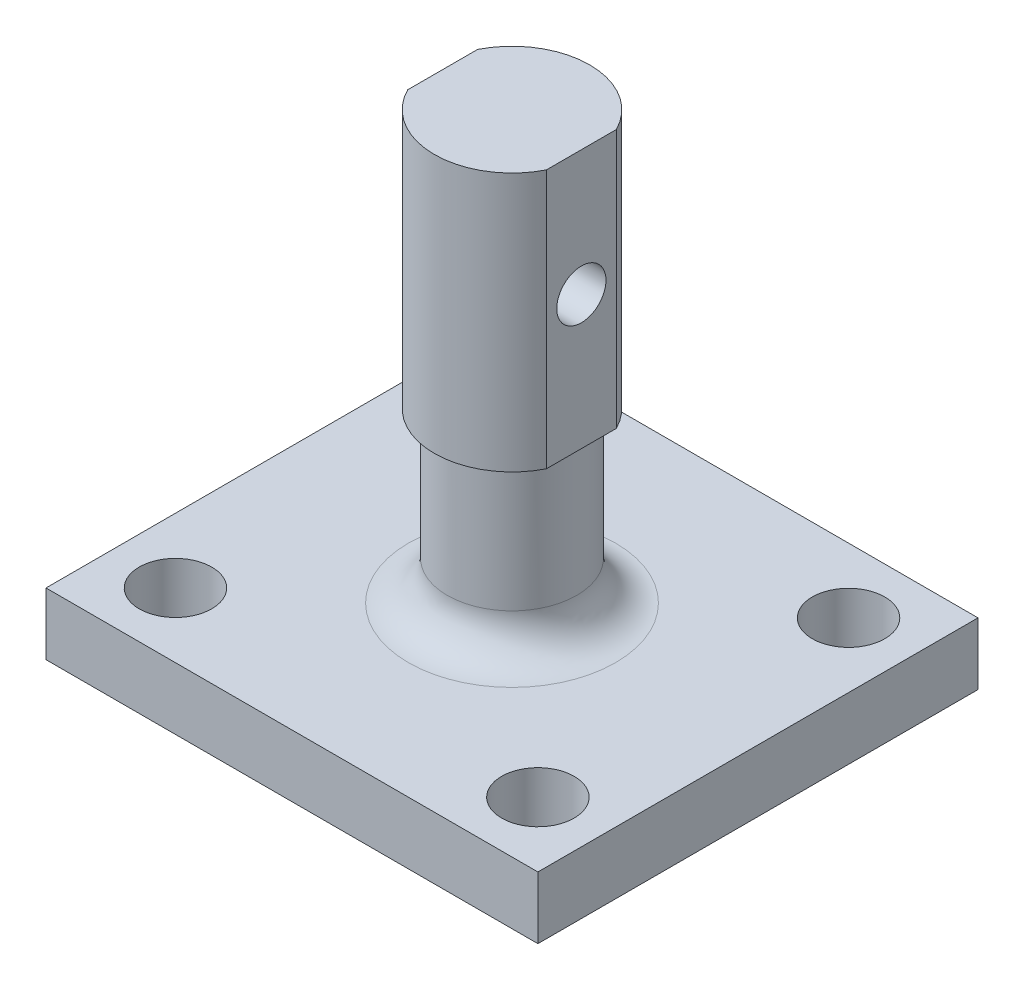
ISO-10303-21;
HEADER;
FILE_DESCRIPTION(('STEP AP214'),'2;1');
FILE_NAME('part.step','',(''),(''),'','','');
FILE_SCHEMA(('AUTOMOTIVE_DESIGN { 1 0 10303 214 1 1 1 1 }'));
ENDSEC;
DATA;
#1=APPLICATION_CONTEXT('core data for automotive mechanical design processes');
#2=APPLICATION_PROTOCOL_DEFINITION('international standard','automotive_design',2000,#1);
#3=PRODUCT_CONTEXT('',#1,'mechanical');
#4=PRODUCT('Part','Part','',(#3));
#5=PRODUCT_RELATED_PRODUCT_CATEGORY('part','',(#4));
#6=PRODUCT_DEFINITION_FORMATION('','',#4);
#7=PRODUCT_DEFINITION_CONTEXT('part definition',#1,'design');
#8=PRODUCT_DEFINITION('design','',#6,#7);
#9=PRODUCT_DEFINITION_SHAPE('','',#8);
#10=(LENGTH_UNIT() NAMED_UNIT(*) SI_UNIT(.MILLI.,.METRE.));
#11=(NAMED_UNIT(*) PLANE_ANGLE_UNIT() SI_UNIT($,.RADIAN.));
#12=(NAMED_UNIT(*) SI_UNIT($,.STERADIAN.) SOLID_ANGLE_UNIT());
#13=UNCERTAINTY_MEASURE_WITH_UNIT(LENGTH_MEASURE(1.E-05),#10,'distance_accuracy_value','');
#14=(GEOMETRIC_REPRESENTATION_CONTEXT(3) GLOBAL_UNCERTAINTY_ASSIGNED_CONTEXT((#13)) GLOBAL_UNIT_ASSIGNED_CONTEXT((#10,
#11,#12)) REPRESENTATION_CONTEXT('',''));
#15=CARTESIAN_POINT('',(0.,0.,0.));
#16=DIRECTION('',(0.,0.,1.));
#17=DIRECTION('',(1.,0.,0.));
#18=AXIS2_PLACEMENT_3D('',#15,#16,#17);
#19=CARTESIAN_POINT('',(0.,9.45,0.));
#20=DIRECTION('',(0.,-1.,0.));
#21=DIRECTION('',(0.,0.,-1.));
#22=AXIS2_PLACEMENT_3D('',#19,#20,#21);
#23=CYLINDRICAL_SURFACE('',#22,1.5);
#24=CARTESIAN_POINT('',(0.,9.45,0.));
#25=DIRECTION('',(0.,1.,0.));
#26=DIRECTION('',(0.,0.,1.));
#27=AXIS2_PLACEMENT_3D('',#24,#25,#26);
#28=CIRCLE('',#27,1.5);
#29=CARTESIAN_POINT('',(-1.33954283246188,9.45,0.675));
#30=VERTEX_POINT('',#29);
#31=CARTESIAN_POINT('',(1.33954283246188,9.45,0.675));
#32=VERTEX_POINT('',#31);
#33=EDGE_CURVE('E126',#30,#32,#28,.T.);
#34=ORIENTED_EDGE('',*,*,#33,.F.);
#35=DIRECTION('',(0.,1.,0.));
#36=VECTOR('',#35,1.);
#37=CARTESIAN_POINT('',(-1.33954283246188,3.45,0.675));
#38=LINE('',#37,#36);
#39=CARTESIAN_POINT('',(-1.33954283246188,4.45,0.675));
#40=VERTEX_POINT('',#39);
#41=EDGE_CURVE('E111',#40,#30,#38,.T.);
#42=ORIENTED_EDGE('',*,*,#41,.F.);
#43=CARTESIAN_POINT('',(0.,4.45,0.));
#44=DIRECTION('',(0.,1.,0.));
#45=DIRECTION('',(0.,0.,1.));
#46=AXIS2_PLACEMENT_3D('',#43,#44,#45);
#47=CIRCLE('',#46,1.5);
#48=CARTESIAN_POINT('',(1.33954283246188,4.45,0.675));
#49=VERTEX_POINT('',#48);
#50=EDGE_CURVE('E139',#40,#49,#47,.T.);
#51=ORIENTED_EDGE('',*,*,#50,.T.);
#52=DIRECTION('',(0.,1.,0.));
#53=VECTOR('',#52,1.);
#54=CARTESIAN_POINT('',(1.33954283246188,3.45,0.675));
#55=LINE('',#54,#53);
#56=EDGE_CURVE('E71',#49,#32,#55,.T.);
#57=ORIENTED_EDGE('',*,*,#56,.T.);
#58=EDGE_LOOP('',(#34,#42,#51,#57));
#59=FACE_BOUND('',#58,.T.);
#60=ADVANCED_FACE('F47',(#59),#23,.T.);
#61=CARTESIAN_POINT('',(4.75,1.2,-4.25));
#62=DIRECTION('',(-1.,0.,0.));
#63=DIRECTION('',(0.,0.,1.));
#64=AXIS2_PLACEMENT_3D('',#61,#62,#63);
#65=PLANE('',#64);
#66=DIRECTION('',(0.,0.,-1.));
#67=VECTOR('',#66,1.);
#68=CARTESIAN_POINT('',(4.75,0.,-4.25));
#69=LINE('',#68,#67);
#70=CARTESIAN_POINT('',(4.75,0.,4.25));
#71=VERTEX_POINT('',#70);
#72=CARTESIAN_POINT('',(4.75,0.,-4.25));
#73=VERTEX_POINT('',#72);
#74=EDGE_CURVE('E181',#71,#73,#69,.T.);
#75=ORIENTED_EDGE('',*,*,#74,.T.);
#76=DIRECTION('',(0.,-1.,0.));
#77=VECTOR('',#76,1.);
#78=CARTESIAN_POINT('',(4.75,1.2,-4.25));
#79=LINE('',#78,#77);
#80=CARTESIAN_POINT('',(4.75,1.2,-4.25));
#81=VERTEX_POINT('',#80);
#82=EDGE_CURVE('E218',#81,#73,#79,.T.);
#83=ORIENTED_EDGE('',*,*,#82,.F.);
#84=DIRECTION('',(0.,0.,-1.));
#85=VECTOR('',#84,1.);
#86=CARTESIAN_POINT('',(4.75,1.2,-4.25));
#87=LINE('',#86,#85);
#88=CARTESIAN_POINT('',(4.75,1.2,4.25));
#89=VERTEX_POINT('',#88);
#90=EDGE_CURVE('E182',#89,#81,#87,.T.);
#91=ORIENTED_EDGE('',*,*,#90,.F.);
#92=DIRECTION('',(0.,-1.,0.));
#93=VECTOR('',#92,1.);
#94=CARTESIAN_POINT('',(4.75,1.2,4.25));
#95=LINE('',#94,#93);
#96=EDGE_CURVE('E196',#89,#71,#95,.T.);
#97=ORIENTED_EDGE('',*,*,#96,.T.);
#98=EDGE_LOOP('',(#75,#83,#91,#97));
#99=FACE_BOUND('',#98,.T.);
#100=ADVANCED_FACE('F268',(#99),#65,.F.);
#101=CARTESIAN_POINT('',(-4.75,1.2,-4.25));
#102=DIRECTION('',(0.,0.,1.));
#103=DIRECTION('',(1.,0.,0.));
#104=AXIS2_PLACEMENT_3D('',#101,#102,#103);
#105=PLANE('',#104);
#106=DIRECTION('',(-1.,0.,0.));
#107=VECTOR('',#106,1.);
#108=CARTESIAN_POINT('',(-4.75,0.,-4.25));
#109=LINE('',#108,#107);
#110=CARTESIAN_POINT('',(-4.75,0.,-4.25));
#111=VERTEX_POINT('',#110);
#112=EDGE_CURVE('E200',#73,#111,#109,.T.);
#113=ORIENTED_EDGE('',*,*,#112,.T.);
#114=DIRECTION('',(0.,-1.,0.));
#115=VECTOR('',#114,1.);
#116=CARTESIAN_POINT('',(-4.75,1.2,-4.25));
#117=LINE('',#116,#115);
#118=CARTESIAN_POINT('',(-4.75,1.2,-4.25));
#119=VERTEX_POINT('',#118);
#120=EDGE_CURVE('E214',#119,#111,#117,.T.);
#121=ORIENTED_EDGE('',*,*,#120,.F.);
#122=DIRECTION('',(-1.,0.,0.));
#123=VECTOR('',#122,1.);
#124=CARTESIAN_POINT('',(-4.75,1.2,-4.25));
#125=LINE('',#124,#123);
#126=EDGE_CURVE('E186',#81,#119,#125,.T.);
#127=ORIENTED_EDGE('',*,*,#126,.F.);
#128=ORIENTED_EDGE('',*,*,#82,.T.);
#129=EDGE_LOOP('',(#113,#121,#127,#128));
#130=FACE_BOUND('',#129,.T.);
#131=ADVANCED_FACE('F273',(#130),#105,.F.);
#132=CARTESIAN_POINT('',(-4.75,1.2,-4.25));
#133=DIRECTION('',(1.,0.,0.));
#134=DIRECTION('',(0.,0.,-1.));
#135=AXIS2_PLACEMENT_3D('',#132,#133,#134);
#136=PLANE('',#135);
#137=DIRECTION('',(0.,0.,1.));
#138=VECTOR('',#137,1.);
#139=CARTESIAN_POINT('',(-4.75,0.,-4.25));
#140=LINE('',#139,#138);
#141=CARTESIAN_POINT('',(-4.75,0.,4.25));
#142=VERTEX_POINT('',#141);
#143=EDGE_CURVE('E203',#111,#142,#140,.T.);
#144=ORIENTED_EDGE('',*,*,#143,.T.);
#145=DIRECTION('',(0.,-1.,0.));
#146=VECTOR('',#145,1.);
#147=CARTESIAN_POINT('',(-4.75,1.2,4.25));
#148=LINE('',#147,#146);
#149=CARTESIAN_POINT('',(-4.75,1.2,4.25));
#150=VERTEX_POINT('',#149);
#151=EDGE_CURVE('E210',#150,#142,#148,.T.);
#152=ORIENTED_EDGE('',*,*,#151,.F.);
#153=DIRECTION('',(0.,0.,1.));
#154=VECTOR('',#153,1.);
#155=CARTESIAN_POINT('',(-4.75,1.2,-4.25));
#156=LINE('',#155,#154);
#157=EDGE_CURVE('E190',#119,#150,#156,.T.);
#158=ORIENTED_EDGE('',*,*,#157,.F.);
#159=ORIENTED_EDGE('',*,*,#120,.T.);
#160=EDGE_LOOP('',(#144,#152,#158,#159));
#161=FACE_BOUND('',#160,.T.);
#162=ADVANCED_FACE('F319',(#161),#136,.F.);
#163=CARTESIAN_POINT('',(-4.75,1.2,4.25));
#164=DIRECTION('',(0.,0.,-1.));
#165=DIRECTION('',(-1.,0.,0.));
#166=AXIS2_PLACEMENT_3D('',#163,#164,#165);
#167=PLANE('',#166);
#168=DIRECTION('',(1.,0.,0.));
#169=VECTOR('',#168,1.);
#170=CARTESIAN_POINT('',(-4.75,0.,4.25));
#171=LINE('',#170,#169);
#172=EDGE_CURVE('E187',#142,#71,#171,.T.);
#173=ORIENTED_EDGE('',*,*,#172,.T.);
#174=ORIENTED_EDGE('',*,*,#96,.F.);
#175=DIRECTION('',(1.,0.,0.));
#176=VECTOR('',#175,1.);
#177=CARTESIAN_POINT('',(-4.75,1.2,4.25));
#178=LINE('',#177,#176);
#179=EDGE_CURVE('E193',#150,#89,#178,.T.);
#180=ORIENTED_EDGE('',*,*,#179,.F.);
#181=ORIENTED_EDGE('',*,*,#151,.T.);
#182=EDGE_LOOP('',(#173,#174,#180,#181));
#183=FACE_BOUND('',#182,.T.);
#184=ADVANCED_FACE('F298',(#183),#167,.F.);
#185=CARTESIAN_POINT('',(0.,1.2,0.));
#186=DIRECTION('',(0.,1.,0.));
#187=DIRECTION('',(0.,0.,1.));
#188=AXIS2_PLACEMENT_3D('',#185,#186,#187);
#189=PLANE('',#188);
#190=CARTESIAN_POINT('',(0.,1.2,0.));
#191=DIRECTION('',(0.,1.,0.));
#192=DIRECTION('',(0.,0.,1.));
#193=AXIS2_PLACEMENT_3D('',#190,#191,#192);
#194=CIRCLE('',#193,2.);
#195=CARTESIAN_POINT('',(0.,1.2,2.));
#196=VERTEX_POINT('',#195);
#197=EDGE_CURVE('E226',#196,#196,#194,.F.);
#198=ORIENTED_EDGE('',*,*,#197,.T.);
#199=EDGE_LOOP('',(#198));
#200=FACE_BOUND('',#199,.T.);
#201=CARTESIAN_POINT('',(3.5,1.2,3.));
#202=DIRECTION('',(0.,1.,0.));
#203=DIRECTION('',(0.,0.,1.));
#204=AXIS2_PLACEMENT_3D('',#201,#202,#203);
#205=CIRCLE('',#204,0.699999999999999);
#206=CARTESIAN_POINT('',(3.5,1.2,3.7));
#207=VERTEX_POINT('',#206);
#208=EDGE_CURVE('E177',#207,#207,#205,.T.);
#209=ORIENTED_EDGE('',*,*,#208,.F.);
#210=EDGE_LOOP('',(#209));
#211=FACE_BOUND('',#210,.T.);
#212=CARTESIAN_POINT('',(3.5,1.2,-3.));
#213=DIRECTION('',(0.,1.,0.));
#214=DIRECTION('',(0.,0.,1.));
#215=AXIS2_PLACEMENT_3D('',#212,#213,#214);
#216=CIRCLE('',#215,0.699999999999999);
#217=CARTESIAN_POINT('',(3.5,1.2,-2.3));
#218=VERTEX_POINT('',#217);
#219=EDGE_CURVE('E173',#218,#218,#216,.T.);
#220=ORIENTED_EDGE('',*,*,#219,.F.);
#221=EDGE_LOOP('',(#220));
#222=FACE_BOUND('',#221,.T.);
#223=CARTESIAN_POINT('',(-3.5,1.2,-3.));
#224=DIRECTION('',(0.,1.,0.));
#225=DIRECTION('',(0.,0.,1.));
#226=AXIS2_PLACEMENT_3D('',#223,#224,#225);
#227=CIRCLE('',#226,0.7);
#228=CARTESIAN_POINT('',(-3.5,1.2,-2.3));
#229=VERTEX_POINT('',#228);
#230=EDGE_CURVE('E169',#229,#229,#227,.T.);
#231=ORIENTED_EDGE('',*,*,#230,.F.);
#232=EDGE_LOOP('',(#231));
#233=FACE_BOUND('',#232,.T.);
#234=CARTESIAN_POINT('',(-3.5,1.2,3.));
#235=DIRECTION('',(0.,1.,0.));
#236=DIRECTION('',(0.,0.,1.));
#237=AXIS2_PLACEMENT_3D('',#234,#235,#236);
#238=CIRCLE('',#237,0.7);
#239=CARTESIAN_POINT('',(-3.5,1.2,3.7));
#240=VERTEX_POINT('',#239);
#241=EDGE_CURVE('E165',#240,#240,#238,.T.);
#242=ORIENTED_EDGE('',*,*,#241,.F.);
#243=EDGE_LOOP('',(#242));
#244=FACE_BOUND('',#243,.T.);
#245=ORIENTED_EDGE('',*,*,#90,.T.);
#246=ORIENTED_EDGE('',*,*,#126,.T.);
#247=ORIENTED_EDGE('',*,*,#157,.T.);
#248=ORIENTED_EDGE('',*,*,#179,.T.);
#249=EDGE_LOOP('',(#245,#246,#247,#248));
#250=FACE_BOUND('',#249,.T.);
#251=ADVANCED_FACE('F294',(#200,#211,#222,#233,#244,#250),#189,.T.);
#252=CARTESIAN_POINT('',(0.,0.,0.));
#253=DIRECTION('',(0.,1.,0.));
#254=DIRECTION('',(0.,0.,1.));
#255=AXIS2_PLACEMENT_3D('',#252,#253,#254);
#256=PLANE('',#255);
#257=CARTESIAN_POINT('',(3.5,0.,3.));
#258=DIRECTION('',(0.,1.,0.));
#259=DIRECTION('',(0.,0.,1.));
#260=AXIS2_PLACEMENT_3D('',#257,#258,#259);
#261=CIRCLE('',#260,0.699999999999999);
#262=CARTESIAN_POINT('',(3.5,0.,3.7));
#263=VERTEX_POINT('',#262);
#264=EDGE_CURVE('E149',#263,#263,#261,.T.);
#265=ORIENTED_EDGE('',*,*,#264,.T.);
#266=EDGE_LOOP('',(#265));
#267=FACE_BOUND('',#266,.T.);
#268=CARTESIAN_POINT('',(3.5,0.,-3.));
#269=DIRECTION('',(0.,1.,0.));
#270=DIRECTION('',(0.,0.,1.));
#271=AXIS2_PLACEMENT_3D('',#268,#269,#270);
#272=CIRCLE('',#271,0.699999999999999);
#273=CARTESIAN_POINT('',(3.5,0.,-2.3));
#274=VERTEX_POINT('',#273);
#275=EDGE_CURVE('E155',#274,#274,#272,.T.);
#276=ORIENTED_EDGE('',*,*,#275,.T.);
#277=EDGE_LOOP('',(#276));
#278=FACE_BOUND('',#277,.T.);
#279=CARTESIAN_POINT('',(-3.5,0.,-3.));
#280=DIRECTION('',(0.,1.,0.));
#281=DIRECTION('',(0.,0.,1.));
#282=AXIS2_PLACEMENT_3D('',#279,#280,#281);
#283=CIRCLE('',#282,0.7);
#284=CARTESIAN_POINT('',(-3.5,0.,-2.3));
#285=VERTEX_POINT('',#284);
#286=EDGE_CURVE('E150',#285,#285,#283,.T.);
#287=ORIENTED_EDGE('',*,*,#286,.T.);
#288=EDGE_LOOP('',(#287));
#289=FACE_BOUND('',#288,.T.);
#290=CARTESIAN_POINT('',(-3.5,0.,3.));
#291=DIRECTION('',(0.,1.,0.));
#292=DIRECTION('',(0.,0.,1.));
#293=AXIS2_PLACEMENT_3D('',#290,#291,#292);
#294=CIRCLE('',#293,0.7);
#295=CARTESIAN_POINT('',(-3.5,0.,3.7));
#296=VERTEX_POINT('',#295);
#297=EDGE_CURVE('E154',#296,#296,#294,.T.);
#298=ORIENTED_EDGE('',*,*,#297,.T.);
#299=EDGE_LOOP('',(#298));
#300=FACE_BOUND('',#299,.T.);
#301=ORIENTED_EDGE('',*,*,#74,.F.);
#302=ORIENTED_EDGE('',*,*,#172,.F.);
#303=ORIENTED_EDGE('',*,*,#143,.F.);
#304=ORIENTED_EDGE('',*,*,#112,.F.);
#305=EDGE_LOOP('',(#301,#302,#303,#304));
#306=FACE_BOUND('',#305,.T.);
#307=ADVANCED_FACE('F297',(#267,#278,#289,#300,#306),#256,.F.);
#308=CARTESIAN_POINT('',(-3.5,0.,3.));
#309=DIRECTION('',(0.,1.,0.));
#310=DIRECTION('',(0.,0.,1.));
#311=AXIS2_PLACEMENT_3D('',#308,#309,#310);
#312=CYLINDRICAL_SURFACE('',#311,0.7);
#313=ORIENTED_EDGE('',*,*,#241,.T.);
#314=EDGE_LOOP('',(#313));
#315=FACE_BOUND('',#314,.T.);
#316=ORIENTED_EDGE('',*,*,#297,.F.);
#317=EDGE_LOOP('',(#316));
#318=FACE_BOUND('',#317,.T.);
#319=ADVANCED_FACE('F324',(#315,#318),#312,.F.);
#320=CARTESIAN_POINT('',(-3.5,0.,-3.));
#321=DIRECTION('',(0.,1.,0.));
#322=DIRECTION('',(0.,0.,1.));
#323=AXIS2_PLACEMENT_3D('',#320,#321,#322);
#324=CYLINDRICAL_SURFACE('',#323,0.7);
#325=ORIENTED_EDGE('',*,*,#230,.T.);
#326=EDGE_LOOP('',(#325));
#327=FACE_BOUND('',#326,.T.);
#328=ORIENTED_EDGE('',*,*,#286,.F.);
#329=EDGE_LOOP('',(#328));
#330=FACE_BOUND('',#329,.T.);
#331=ADVANCED_FACE('F330',(#327,#330),#324,.F.);
#332=CARTESIAN_POINT('',(3.5,0.,-3.));
#333=DIRECTION('',(0.,1.,0.));
#334=DIRECTION('',(0.,0.,1.));
#335=AXIS2_PLACEMENT_3D('',#332,#333,#334);
#336=CYLINDRICAL_SURFACE('',#335,0.699999999999999);
#337=ORIENTED_EDGE('',*,*,#219,.T.);
#338=EDGE_LOOP('',(#337));
#339=FACE_BOUND('',#338,.T.);
#340=ORIENTED_EDGE('',*,*,#275,.F.);
#341=EDGE_LOOP('',(#340));
#342=FACE_BOUND('',#341,.T.);
#343=ADVANCED_FACE('F370',(#339,#342),#336,.F.);
#344=CARTESIAN_POINT('',(3.5,0.,3.));
#345=DIRECTION('',(0.,1.,0.));
#346=DIRECTION('',(0.,0.,1.));
#347=AXIS2_PLACEMENT_3D('',#344,#345,#346);
#348=CYLINDRICAL_SURFACE('',#347,0.699999999999999);
#349=ORIENTED_EDGE('',*,*,#208,.T.);
#350=EDGE_LOOP('',(#349));
#351=FACE_BOUND('',#350,.T.);
#352=ORIENTED_EDGE('',*,*,#264,.F.);
#353=EDGE_LOOP('',(#352));
#354=FACE_BOUND('',#353,.T.);
#355=ADVANCED_FACE('F286',(#351,#354),#348,.F.);
#356=CARTESIAN_POINT('',(0.,4.45,0.));
#357=DIRECTION('',(0.,-1.,0.));
#358=DIRECTION('',(0.,0.,-1.));
#359=AXIS2_PLACEMENT_3D('',#356,#357,#358);
#360=CYLINDRICAL_SURFACE('',#359,1.25);
#361=CARTESIAN_POINT('',(0.,1.95,0.));
#362=DIRECTION('',(0.,1.,0.));
#363=DIRECTION('',(0.,0.,1.));
#364=AXIS2_PLACEMENT_3D('',#361,#362,#363);
#365=CIRCLE('',#364,1.25);
#366=CARTESIAN_POINT('',(0.,1.95,-1.25));
#367=VERTEX_POINT('',#366);
#368=EDGE_CURVE('E222',#367,#367,#365,.T.);
#369=CARTESIAN_POINT('',(0.,4.45,0.));
#370=DIRECTION('',(0.,1.,0.));
#371=DIRECTION('',(0.,0.,1.));
#372=AXIS2_PLACEMENT_3D('',#369,#370,#371);
#373=CIRCLE('',#372,1.25);
#374=CARTESIAN_POINT('',(0.,4.45,-1.25));
#375=VERTEX_POINT('',#374);
#376=EDGE_CURVE('E136',#375,#375,#373,.T.);
#377=CARTESIAN_POINT('',(0.,1.95,-1.25));
#378=CARTESIAN_POINT('',(0.,1.97604166666667,-1.25));
#379=CARTESIAN_POINT('',(0.,2.00208333333333,-1.25));
#380=CARTESIAN_POINT('',(0.,2.05416666666667,-1.25));
#381=CARTESIAN_POINT('',(0.,2.08020833333333,-1.25));
#382=CARTESIAN_POINT('',(0.,2.13229166666667,-1.25));
#383=CARTESIAN_POINT('',(0.,2.15833333333333,-1.25));
#384=CARTESIAN_POINT('',(0.,2.21041666666667,-1.25));
#385=CARTESIAN_POINT('',(0.,2.23645833333333,-1.25));
#386=CARTESIAN_POINT('',(0.,2.28854166666667,-1.25));
#387=CARTESIAN_POINT('',(0.,2.31458333333333,-1.25));
#388=CARTESIAN_POINT('',(0.,2.36666666666667,-1.25));
#389=CARTESIAN_POINT('',(0.,2.39270833333333,-1.25));
#390=CARTESIAN_POINT('',(0.,2.44479166666667,-1.25));
#391=CARTESIAN_POINT('',(0.,2.47083333333333,-1.25));
#392=CARTESIAN_POINT('',(0.,2.52291666666667,-1.25));
#393=CARTESIAN_POINT('',(0.,2.54895833333333,-1.25));
#394=CARTESIAN_POINT('',(0.,2.60104166666667,-1.25));
#395=CARTESIAN_POINT('',(0.,2.62708333333333,-1.25));
#396=CARTESIAN_POINT('',(0.,2.67916666666667,-1.25));
#397=CARTESIAN_POINT('',(0.,2.70520833333333,-1.25));
#398=CARTESIAN_POINT('',(0.,2.75729166666667,-1.25));
#399=CARTESIAN_POINT('',(0.,2.78333333333333,-1.25));
#400=CARTESIAN_POINT('',(0.,2.83541666666667,-1.25));
#401=CARTESIAN_POINT('',(0.,2.86145833333333,-1.25));
#402=CARTESIAN_POINT('',(0.,2.91354166666667,-1.25));
#403=CARTESIAN_POINT('',(0.,2.93958333333333,-1.25));
#404=CARTESIAN_POINT('',(0.,2.99166666666667,-1.25));
#405=CARTESIAN_POINT('',(0.,3.01770833333333,-1.25));
#406=CARTESIAN_POINT('',(0.,3.06979166666667,-1.25));
#407=CARTESIAN_POINT('',(0.,3.09583333333333,-1.25));
#408=CARTESIAN_POINT('',(0.,3.14791666666667,-1.25));
#409=CARTESIAN_POINT('',(0.,3.17395833333333,-1.25));
#410=CARTESIAN_POINT('',(0.,3.22604166666667,-1.25));
#411=CARTESIAN_POINT('',(0.,3.25208333333333,-1.25));
#412=CARTESIAN_POINT('',(0.,3.30416666666667,-1.25));
#413=CARTESIAN_POINT('',(0.,3.33020833333333,-1.25));
#414=CARTESIAN_POINT('',(0.,3.38229166666667,-1.25));
#415=CARTESIAN_POINT('',(0.,3.40833333333333,-1.25));
#416=CARTESIAN_POINT('',(0.,3.46041666666667,-1.25));
#417=CARTESIAN_POINT('',(0.,3.48645833333333,-1.25));
#418=CARTESIAN_POINT('',(0.,3.53854166666667,-1.25));
#419=CARTESIAN_POINT('',(0.,3.56458333333333,-1.25));
#420=CARTESIAN_POINT('',(0.,3.61666666666667,-1.25));
#421=CARTESIAN_POINT('',(0.,3.64270833333333,-1.25));
#422=CARTESIAN_POINT('',(0.,3.69479166666667,-1.25));
#423=CARTESIAN_POINT('',(0.,3.72083333333333,-1.25));
#424=CARTESIAN_POINT('',(0.,3.77291666666667,-1.25));
#425=CARTESIAN_POINT('',(0.,3.79895833333333,-1.25));
#426=CARTESIAN_POINT('',(0.,3.85104166666667,-1.25));
#427=CARTESIAN_POINT('',(0.,3.87708333333333,-1.25));
#428=CARTESIAN_POINT('',(0.,3.92916666666667,-1.25));
#429=CARTESIAN_POINT('',(0.,3.95520833333333,-1.25));
#430=CARTESIAN_POINT('',(0.,4.00729166666667,-1.25));
#431=CARTESIAN_POINT('',(0.,4.03333333333333,-1.25));
#432=CARTESIAN_POINT('',(0.,4.08541666666667,-1.25));
#433=CARTESIAN_POINT('',(0.,4.11145833333333,-1.25));
#434=CARTESIAN_POINT('',(0.,4.16354166666667,-1.25));
#435=CARTESIAN_POINT('',(0.,4.18958333333333,-1.25));
#436=CARTESIAN_POINT('',(0.,4.24166666666667,-1.25));
#437=CARTESIAN_POINT('',(0.,4.26770833333333,-1.25));
#438=CARTESIAN_POINT('',(0.,4.31979166666667,-1.25));
#439=CARTESIAN_POINT('',(0.,4.34583333333333,-1.25));
#440=CARTESIAN_POINT('',(0.,4.39791666666667,-1.25));
#441=CARTESIAN_POINT('',(0.,4.42395833333333,-1.25));
#442=CARTESIAN_POINT('',(0.,4.45,-1.25));
#443=B_SPLINE_CURVE_WITH_KNOTS('',3,(#377,#378,#379,#380,#381,#382,#383,#384,#385,#386,#387,
#388,#389,#390,#391,#392,#393,#394,#395,#396,#397,#398,#399,#400,#401,#402,#403,#404,#405,#406,
#407,#408,#409,#410,#411,#412,#413,#414,#415,#416,#417,#418,#419,#420,#421,#422,#423,#424,#425,
#426,#427,#428,#429,#430,#431,#432,#433,#434,#435,#436,#437,#438,#439,#440,#441,#442),
.UNSPECIFIED.,.F.,.F.,(4,2,2,2,2,2,2,2,2,2,2,2,2,2,2,2,2,2,2,2,2,2,2,2,2,2,2,2,2,2,2,2,4),(0.,
0.0781250000000001,0.15625,0.234375,0.3125,0.390625,0.46875,0.546875,0.625,0.703125,0.78125,
0.859374999999999,0.9375,1.015625,1.09375,1.171875,1.25,1.328125,1.40625,1.484375,1.5625,
1.640625,1.71875,1.796875,1.875,1.953125,2.03125,2.109375,2.1875,2.265625,2.34375,2.421875,2.5),.UNSPECIFIED.);
#444=EDGE_CURVE('BSEAM281',#367,#375,#443,.T.);
#445=ORIENTED_EDGE('',*,*,#368,.T.);
#446=ORIENTED_EDGE('',*,*,#376,.F.);
#447=ORIENTED_EDGE('',*,*,#444,.T.);
#448=ORIENTED_EDGE('',*,*,#444,.F.);
#449=EDGE_LOOP('',(#445,#447,#446,#448));
#450=FACE_BOUND('',#449,.T.);
#451=ADVANCED_FACE('F281',(#450),#360,.T.);
#452=CARTESIAN_POINT('',(0.,1.95,0.));
#453=DIRECTION('',(0.,1.,0.));
#454=DIRECTION('',(0.,0.,1.));
#455=AXIS2_PLACEMENT_3D('',#452,#453,#454);
#456=TOROIDAL_SURFACE('',#455,2.,0.75);
#457=ORIENTED_EDGE('',*,*,#197,.F.);
#458=EDGE_LOOP('',(#457));
#459=FACE_BOUND('',#458,.T.);
#460=ORIENTED_EDGE('',*,*,#368,.F.);
#461=EDGE_LOOP('',(#460));
#462=FACE_BOUND('',#461,.T.);
#463=ADVANCED_FACE('F49',(#459,#462),#456,.F.);
#464=CARTESIAN_POINT('',(1.33954283246188,4.45,-0.675));
#465=VERTEX_POINT('',#464);
#466=CARTESIAN_POINT('',(-1.33954283246188,4.45,-0.675));
#467=VERTEX_POINT('',#466);
#468=EDGE_CURVE('E132',#465,#467,#47,.T.);
#469=ORIENTED_EDGE('',*,*,#468,.T.);
#470=DIRECTION('',(0.,1.,0.));
#471=VECTOR('',#470,1.);
#472=CARTESIAN_POINT('',(-1.33954283246188,3.45,-0.675));
#473=LINE('',#472,#471);
#474=CARTESIAN_POINT('',(-1.33954283246188,9.45,-0.675));
#475=VERTEX_POINT('',#474);
#476=EDGE_CURVE('E64',#467,#475,#473,.T.);
#477=ORIENTED_EDGE('',*,*,#476,.T.);
#478=CARTESIAN_POINT('',(1.33954283246188,9.45,-0.675));
#479=VERTEX_POINT('',#478);
#480=EDGE_CURVE('E128',#479,#475,#28,.T.);
#481=ORIENTED_EDGE('',*,*,#480,.F.);
#482=DIRECTION('',(0.,1.,0.));
#483=VECTOR('',#482,1.);
#484=CARTESIAN_POINT('',(1.33954283246188,3.45,-0.675));
#485=LINE('',#484,#483);
#486=EDGE_CURVE('E142',#465,#479,#485,.T.);
#487=ORIENTED_EDGE('',*,*,#486,.F.);
#488=EDGE_LOOP('',(#469,#477,#481,#487));
#489=FACE_BOUND('',#488,.T.);
#490=ADVANCED_FACE('F237',(#489),#23,.T.);
#491=CARTESIAN_POINT('',(0.,9.45,0.));
#492=DIRECTION('',(0.,1.,0.));
#493=DIRECTION('',(0.,0.,1.));
#494=AXIS2_PLACEMENT_3D('',#491,#492,#493);
#495=PLANE('',#494);
#496=DIRECTION('',(0.,0.,-1.));
#497=VECTOR('',#496,1.);
#498=CARTESIAN_POINT('',(-1.33954283246188,9.45,-0.675));
#499=LINE('',#498,#497);
#500=EDGE_CURVE('E114',#30,#475,#499,.T.);
#501=ORIENTED_EDGE('',*,*,#500,.F.);
#502=ORIENTED_EDGE('',*,*,#33,.T.);
#503=DIRECTION('',(0.,0.,1.));
#504=VECTOR('',#503,1.);
#505=CARTESIAN_POINT('',(1.33954283246188,9.45,-0.675));
#506=LINE('',#505,#504);
#507=EDGE_CURVE('E239',#479,#32,#506,.T.);
#508=ORIENTED_EDGE('',*,*,#507,.F.);
#509=ORIENTED_EDGE('',*,*,#480,.T.);
#510=EDGE_LOOP('',(#501,#502,#508,#509));
#511=FACE_BOUND('',#510,.T.);
#512=ADVANCED_FACE('F124',(#511),#495,.T.);
#513=CARTESIAN_POINT('',(0.,4.45,0.));
#514=DIRECTION('',(0.,1.,0.));
#515=DIRECTION('',(0.,0.,1.));
#516=AXIS2_PLACEMENT_3D('',#513,#514,#515);
#517=PLANE('',#516);
#518=ORIENTED_EDGE('',*,*,#376,.T.);
#519=EDGE_LOOP('',(#518));
#520=FACE_BOUND('',#519,.T.);
#521=ORIENTED_EDGE('',*,*,#50,.F.);
#522=DIRECTION('',(0.,0.,-1.));
#523=VECTOR('',#522,1.);
#524=CARTESIAN_POINT('',(-1.33954283246188,4.45,0.));
#525=LINE('',#524,#523);
#526=EDGE_CURVE('E13',#40,#467,#525,.T.);
#527=ORIENTED_EDGE('',*,*,#526,.T.);
#528=ORIENTED_EDGE('',*,*,#468,.F.);
#529=DIRECTION('',(0.,0.,1.));
#530=VECTOR('',#529,1.);
#531=CARTESIAN_POINT('',(1.33954283246188,4.45,0.));
#532=LINE('',#531,#530);
#533=EDGE_CURVE('E57',#465,#49,#532,.T.);
#534=ORIENTED_EDGE('',*,*,#533,.T.);
#535=EDGE_LOOP('',(#521,#527,#528,#534));
#536=FACE_BOUND('',#535,.T.);
#537=ADVANCED_FACE('F233',(#520,#536),#517,.F.);
#538=CARTESIAN_POINT('',(1.33954283246188,3.45,-0.675));
#539=DIRECTION('',(-1.,0.,0.));
#540=DIRECTION('',(0.,0.,1.));
#541=AXIS2_PLACEMENT_3D('',#538,#539,#540);
#542=PLANE('',#541);
#543=CARTESIAN_POINT('',(1.33954283246188,7.03,0.));
#544=DIRECTION('',(1.,0.,0.));
#545=DIRECTION('',(0.,0.,-1.));
#546=AXIS2_PLACEMENT_3D('',#543,#544,#545);
#547=CIRCLE('',#546,0.475);
#548=CARTESIAN_POINT('',(1.33954283246188,7.03,-0.475));
#549=VERTEX_POINT('',#548);
#550=EDGE_CURVE('E245',#549,#549,#547,.T.);
#551=ORIENTED_EDGE('',*,*,#550,.F.);
#552=EDGE_LOOP('',(#551));
#553=FACE_BOUND('',#552,.T.);
#554=ORIENTED_EDGE('',*,*,#486,.T.);
#555=ORIENTED_EDGE('',*,*,#507,.T.);
#556=ORIENTED_EDGE('',*,*,#56,.F.);
#557=ORIENTED_EDGE('',*,*,#533,.F.);
#558=EDGE_LOOP('',(#554,#555,#556,#557));
#559=FACE_BOUND('',#558,.T.);
#560=ADVANCED_FACE('F235',(#553,#559),#542,.F.);
#561=CARTESIAN_POINT('',(-1.33954283246188,3.45,-0.675));
#562=DIRECTION('',(1.,0.,0.));
#563=DIRECTION('',(0.,0.,-1.));
#564=AXIS2_PLACEMENT_3D('',#561,#562,#563);
#565=PLANE('',#564);
#566=CARTESIAN_POINT('',(-1.33954283246188,7.03,0.));
#567=DIRECTION('',(1.,0.,0.));
#568=DIRECTION('',(0.,0.,-1.));
#569=AXIS2_PLACEMENT_3D('',#566,#567,#568);
#570=CIRCLE('',#569,0.475);
#571=CARTESIAN_POINT('',(-1.33954283246188,7.03,-0.475));
#572=VERTEX_POINT('',#571);
#573=EDGE_CURVE('E51',#572,#572,#570,.T.);
#574=ORIENTED_EDGE('',*,*,#573,.T.);
#575=EDGE_LOOP('',(#574));
#576=FACE_BOUND('',#575,.T.);
#577=ORIENTED_EDGE('',*,*,#41,.T.);
#578=ORIENTED_EDGE('',*,*,#500,.T.);
#579=ORIENTED_EDGE('',*,*,#476,.F.);
#580=ORIENTED_EDGE('',*,*,#526,.F.);
#581=EDGE_LOOP('',(#577,#578,#579,#580));
#582=FACE_BOUND('',#581,.T.);
#583=ADVANCED_FACE('F113',(#576,#582),#565,.F.);
#584=CARTESIAN_POINT('',(-8.66045716753812,7.03,0.));
#585=DIRECTION('',(1.,0.,0.));
#586=DIRECTION('',(0.,0.,-1.));
#587=AXIS2_PLACEMENT_3D('',#584,#585,#586);
#588=CYLINDRICAL_SURFACE('',#587,0.475);
#589=ORIENTED_EDGE('',*,*,#550,.T.);
#590=EDGE_LOOP('',(#589));
#591=FACE_BOUND('',#590,.T.);
#592=ORIENTED_EDGE('',*,*,#573,.F.);
#593=EDGE_LOOP('',(#592));
#594=FACE_BOUND('',#593,.T.);
#595=ADVANCED_FACE('F253',(#591,#594),#588,.F.);
#596=CLOSED_SHELL('',(#60,#100,#131,#162,#184,#251,#307,#319,#331,#343,#355,#451,#463,#490,#512,
#537,#560,#583,#595));
#597=MANIFOLD_SOLID_BREP('B2',#596);
#598=ADVANCED_BREP_SHAPE_REPRESENTATION('',(#18,#597),#14);
#599=SHAPE_DEFINITION_REPRESENTATION(#9,#598);
ENDSEC;
END-ISO-10303-21;
